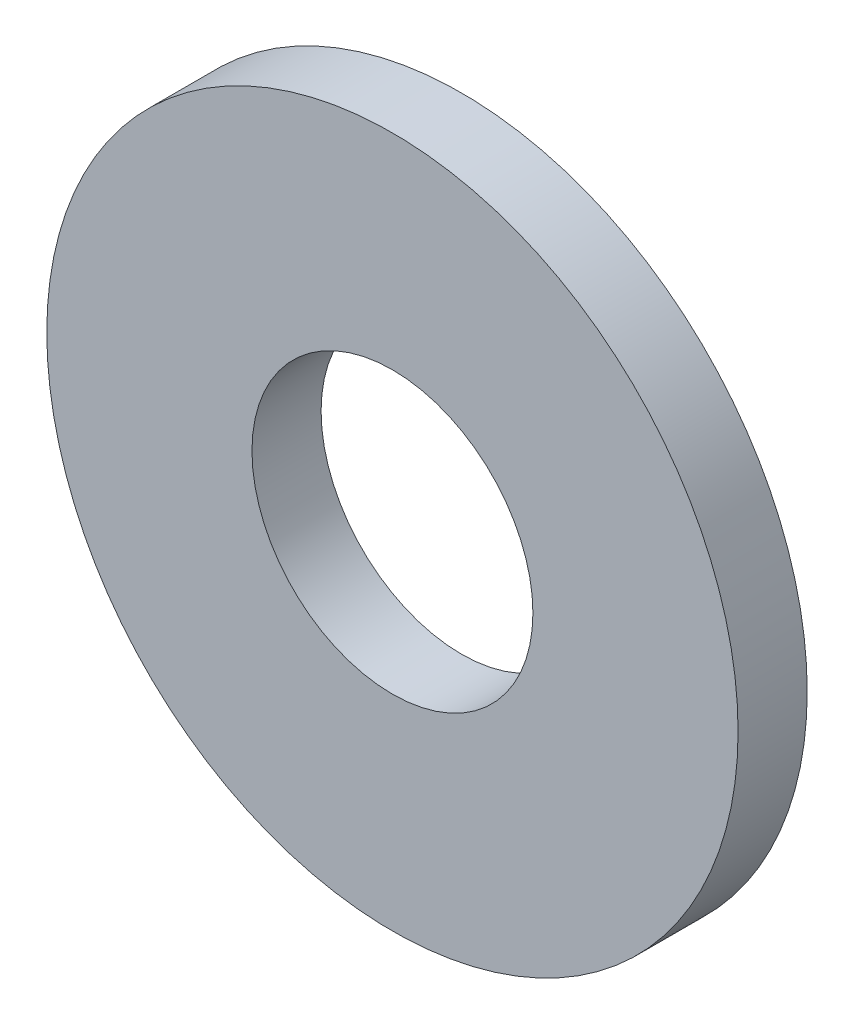
ISO-10303-21;
HEADER;
FILE_DESCRIPTION(('STEP AP214'),'2;1');
FILE_NAME('part.step','',(''),(''),'','','');
FILE_SCHEMA(('AUTOMOTIVE_DESIGN { 1 0 10303 214 1 1 1 1 }'));
ENDSEC;
DATA;
#1=APPLICATION_CONTEXT('core data for automotive mechanical design processes');
#2=APPLICATION_PROTOCOL_DEFINITION('international standard','automotive_design',2000,#1);
#3=PRODUCT_CONTEXT('',#1,'mechanical');
#4=PRODUCT('Part','Part','',(#3));
#5=PRODUCT_RELATED_PRODUCT_CATEGORY('part','',(#4));
#6=PRODUCT_DEFINITION_FORMATION('','',#4);
#7=PRODUCT_DEFINITION_CONTEXT('part definition',#1,'design');
#8=PRODUCT_DEFINITION('design','',#6,#7);
#9=PRODUCT_DEFINITION_SHAPE('','',#8);
#10=(LENGTH_UNIT() NAMED_UNIT(*) SI_UNIT(.MILLI.,.METRE.));
#11=(NAMED_UNIT(*) PLANE_ANGLE_UNIT() SI_UNIT($,.RADIAN.));
#12=(NAMED_UNIT(*) SI_UNIT($,.STERADIAN.) SOLID_ANGLE_UNIT());
#13=UNCERTAINTY_MEASURE_WITH_UNIT(LENGTH_MEASURE(1.E-05),#10,'distance_accuracy_value','');
#14=(GEOMETRIC_REPRESENTATION_CONTEXT(3) GLOBAL_UNCERTAINTY_ASSIGNED_CONTEXT((#13)) GLOBAL_UNIT_ASSIGNED_CONTEXT((#10,
#11,#12)) REPRESENTATION_CONTEXT('',''));
#15=CARTESIAN_POINT('',(0.,0.,0.));
#16=DIRECTION('',(0.,0.,1.));
#17=DIRECTION('',(1.,0.,0.));
#18=AXIS2_PLACEMENT_3D('',#15,#16,#17);
#19=CARTESIAN_POINT('',(0.,0.,0.79375));
#20=DIRECTION('',(0.,0.,1.));
#21=DIRECTION('',(1.,0.,0.));
#22=AXIS2_PLACEMENT_3D('',#19,#20,#21);
#23=PLANE('',#22);
#24=CARTESIAN_POINT('',(0.,0.,0.79375));
#25=DIRECTION('',(0.,0.,1.));
#26=DIRECTION('',(1.,0.,0.));
#27=AXIS2_PLACEMENT_3D('',#24,#25,#26);
#28=CIRCLE('',#27,7.9375);
#29=CARTESIAN_POINT('',(7.9375,0.,0.79375));
#30=VERTEX_POINT('',#29);
#31=EDGE_CURVE('E10',#30,#30,#28,.T.);
#32=ORIENTED_EDGE('',*,*,#31,.T.);
#33=EDGE_LOOP('',(#32));
#34=FACE_BOUND('',#33,.T.);
#35=CARTESIAN_POINT('',(0.,0.,0.79375));
#36=DIRECTION('',(0.,0.,1.));
#37=DIRECTION('',(1.,0.,0.));
#38=AXIS2_PLACEMENT_3D('',#35,#36,#37);
#39=CIRCLE('',#38,3.2258);
#40=CARTESIAN_POINT('',(3.2258,0.,0.79375));
#41=VERTEX_POINT('',#40);
#42=EDGE_CURVE('E41',#41,#41,#39,.T.);
#43=ORIENTED_EDGE('',*,*,#42,.F.);
#44=EDGE_LOOP('',(#43));
#45=FACE_BOUND('',#44,.T.);
#46=ADVANCED_FACE('F30',(#34,#45),#23,.T.);
#47=CARTESIAN_POINT('',(0.,0.,-0.79375));
#48=DIRECTION('',(0.,0.,1.));
#49=DIRECTION('',(1.,0.,0.));
#50=AXIS2_PLACEMENT_3D('',#47,#48,#49);
#51=PLANE('',#50);
#52=CARTESIAN_POINT('',(0.,0.,-0.79375));
#53=DIRECTION('',(0.,0.,1.));
#54=DIRECTION('',(1.,0.,0.));
#55=AXIS2_PLACEMENT_3D('',#52,#53,#54);
#56=CIRCLE('',#55,7.9375);
#57=CARTESIAN_POINT('',(7.9375,0.,-0.79375));
#58=VERTEX_POINT('',#57);
#59=EDGE_CURVE('E34',#58,#58,#56,.T.);
#60=ORIENTED_EDGE('',*,*,#59,.F.);
#61=EDGE_LOOP('',(#60));
#62=FACE_BOUND('',#61,.T.);
#63=CARTESIAN_POINT('',(0.,0.,-0.79375));
#64=DIRECTION('',(0.,0.,1.));
#65=DIRECTION('',(1.,0.,0.));
#66=AXIS2_PLACEMENT_3D('',#63,#64,#65);
#67=CIRCLE('',#66,3.2258);
#68=CARTESIAN_POINT('',(3.2258,0.,-0.79375));
#69=VERTEX_POINT('',#68);
#70=EDGE_CURVE('E43',#69,#69,#67,.T.);
#71=ORIENTED_EDGE('',*,*,#70,.T.);
#72=EDGE_LOOP('',(#71));
#73=FACE_BOUND('',#72,.T.);
#74=ADVANCED_FACE('F53',(#62,#73),#51,.F.);
#75=CARTESIAN_POINT('',(0.,0.,0.79375));
#76=DIRECTION('',(0.,0.,-1.));
#77=DIRECTION('',(-1.,0.,0.));
#78=AXIS2_PLACEMENT_3D('',#75,#76,#77);
#79=CYLINDRICAL_SURFACE('',#78,7.9375);
#80=ORIENTED_EDGE('',*,*,#31,.F.);
#81=EDGE_LOOP('',(#80));
#82=FACE_BOUND('',#81,.T.);
#83=ORIENTED_EDGE('',*,*,#59,.T.);
#84=EDGE_LOOP('',(#83));
#85=FACE_BOUND('',#84,.T.);
#86=ADVANCED_FACE('F32',(#82,#85),#79,.T.);
#87=CARTESIAN_POINT('',(0.,0.,0.79375));
#88=DIRECTION('',(0.,0.,-1.));
#89=DIRECTION('',(-1.,0.,0.));
#90=AXIS2_PLACEMENT_3D('',#87,#88,#89);
#91=CYLINDRICAL_SURFACE('',#90,3.2258);
#92=ORIENTED_EDGE('',*,*,#42,.T.);
#93=EDGE_LOOP('',(#92));
#94=FACE_BOUND('',#93,.T.);
#95=ORIENTED_EDGE('',*,*,#70,.F.);
#96=EDGE_LOOP('',(#95));
#97=FACE_BOUND('',#96,.T.);
#98=ADVANCED_FACE('F49',(#94,#97),#91,.F.);
#99=CLOSED_SHELL('',(#46,#74,#86,#98));
#100=MANIFOLD_SOLID_BREP('B2',#99);
#101=ADVANCED_BREP_SHAPE_REPRESENTATION('',(#18,#100),#14);
#102=SHAPE_DEFINITION_REPRESENTATION(#9,#101);
ENDSEC;
END-ISO-10303-21;
